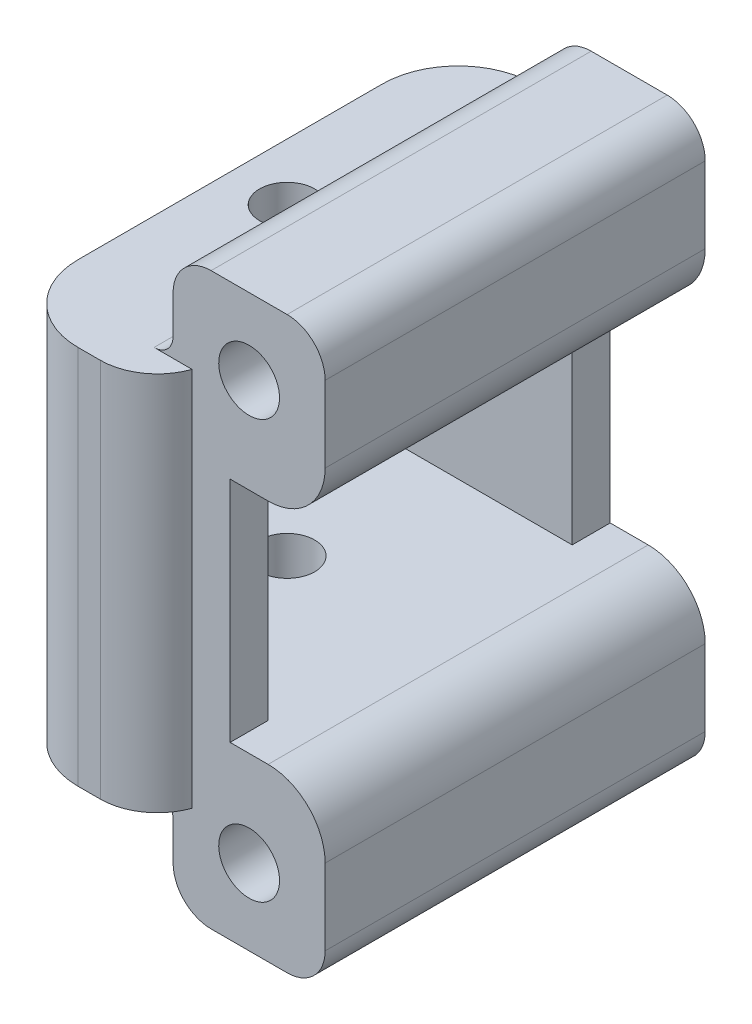
ISO-10303-21;
HEADER;
FILE_DESCRIPTION(('STEP AP214'),'2;1');
FILE_NAME('part.step','',(''),(''),'','','');
FILE_SCHEMA(('AUTOMOTIVE_DESIGN { 1 0 10303 214 1 1 1 1 }'));
ENDSEC;
DATA;
#1=APPLICATION_CONTEXT('core data for automotive mechanical design processes');
#2=APPLICATION_PROTOCOL_DEFINITION('international standard','automotive_design',2000,#1);
#3=PRODUCT_CONTEXT('',#1,'mechanical');
#4=PRODUCT('Part','Part','',(#3));
#5=PRODUCT_RELATED_PRODUCT_CATEGORY('part','',(#4));
#6=PRODUCT_DEFINITION_FORMATION('','',#4);
#7=PRODUCT_DEFINITION_CONTEXT('part definition',#1,'design');
#8=PRODUCT_DEFINITION('design','',#6,#7);
#9=PRODUCT_DEFINITION_SHAPE('','',#8);
#10=(LENGTH_UNIT() NAMED_UNIT(*) SI_UNIT(.MILLI.,.METRE.));
#11=(NAMED_UNIT(*) PLANE_ANGLE_UNIT() SI_UNIT($,.RADIAN.));
#12=(NAMED_UNIT(*) SI_UNIT($,.STERADIAN.) SOLID_ANGLE_UNIT());
#13=UNCERTAINTY_MEASURE_WITH_UNIT(LENGTH_MEASURE(1.E-05),#10,'distance_accuracy_value','');
#14=(GEOMETRIC_REPRESENTATION_CONTEXT(3) GLOBAL_UNCERTAINTY_ASSIGNED_CONTEXT((#13)) GLOBAL_UNIT_ASSIGNED_CONTEXT((#10,
#11,#12)) REPRESENTATION_CONTEXT('',''));
#15=CARTESIAN_POINT('',(0.,0.,0.));
#16=DIRECTION('',(0.,0.,1.));
#17=DIRECTION('',(1.,0.,0.));
#18=AXIS2_PLACEMENT_3D('',#15,#16,#17);
#19=CARTESIAN_POINT('',(6.,0.,0.));
#20=DIRECTION('',(1.,0.,0.));
#21=DIRECTION('',(0.,0.,-1.));
#22=AXIS2_PLACEMENT_3D('',#19,#20,#21);
#23=PLANE('',#22);
#24=DIRECTION('',(0.,0.,1.));
#25=VECTOR('',#24,1.);
#26=CARTESIAN_POINT('',(6.,0.,0.));
#27=LINE('',#26,#25);
#28=CARTESIAN_POINT('',(6.,0.,2.));
#29=VERTEX_POINT('',#28);
#30=CARTESIAN_POINT('',(6.,0.,18.));
#31=VERTEX_POINT('',#30);
#32=EDGE_CURVE('E235',#29,#31,#27,.T.);
#33=ORIENTED_EDGE('',*,*,#32,.F.);
#34=DIRECTION('',(0.,1.,0.));
#35=VECTOR('',#34,1.);
#36=CARTESIAN_POINT('',(6.,-20.,2.));
#37=LINE('',#36,#35);
#38=CARTESIAN_POINT('',(6.,-4.00000000000002,2.));
#39=VERTEX_POINT('',#38);
#40=EDGE_CURVE('E230',#29,#39,#37,.F.);
#41=ORIENTED_EDGE('',*,*,#40,.T.);
#42=DIRECTION('',(0.,0.,-1.));
#43=VECTOR('',#42,1.);
#44=CARTESIAN_POINT('',(6.,-4.,0.));
#45=LINE('',#44,#43);
#46=CARTESIAN_POINT('',(6.,-4.00000000000001,18.));
#47=VERTEX_POINT('',#46);
#48=EDGE_CURVE('E232',#47,#39,#45,.T.);
#49=ORIENTED_EDGE('',*,*,#48,.F.);
#50=DIRECTION('',(0.,-1.,0.));
#51=VECTOR('',#50,1.);
#52=CARTESIAN_POINT('',(6.,0.,18.));
#53=LINE('',#52,#51);
#54=EDGE_CURVE('E453',#47,#31,#53,.F.);
#55=ORIENTED_EDGE('',*,*,#54,.T.);
#56=EDGE_LOOP('',(#33,#41,#49,#55));
#57=FACE_BOUND('',#56,.T.);
#58=ADVANCED_FACE('F34',(#57),#23,.F.);
#59=CARTESIAN_POINT('',(4.,0.,0.));
#60=DIRECTION('',(0.,0.,1.));
#61=DIRECTION('',(0.,-1.,0.));
#62=AXIS2_PLACEMENT_3D('',#59,#60,#61);
#63=PLANE('',#62);
#64=CARTESIAN_POINT('',(17.,1.,0.));
#65=DIRECTION('',(0.,0.,-1.));
#66=DIRECTION('',(0.,1.,0.));
#67=AXIS2_PLACEMENT_3D('',#64,#65,#66);
#68=CIRCLE('',#67,1.6);
#69=CARTESIAN_POINT('',(17.,2.6,0.));
#70=VERTEX_POINT('',#69);
#71=EDGE_CURVE('E325',#70,#70,#68,.T.);
#72=ORIENTED_EDGE('',*,*,#71,.F.);
#73=EDGE_LOOP('',(#72));
#74=FACE_BOUND('',#73,.T.);
#75=CARTESIAN_POINT('',(16.9999999999991,-21.,0.));
#76=DIRECTION('',(0.,0.,-1.));
#77=DIRECTION('',(0.,1.,0.));
#78=AXIS2_PLACEMENT_3D('',#75,#76,#77);
#79=CIRCLE('',#78,1.6);
#80=CARTESIAN_POINT('',(16.9999999999991,-19.4,0.));
#81=VERTEX_POINT('',#80);
#82=EDGE_CURVE('E321',#81,#81,#79,.T.);
#83=ORIENTED_EDGE('',*,*,#82,.F.);
#84=EDGE_LOOP('',(#83));
#85=FACE_BOUND('',#84,.T.);
#86=DIRECTION('',(1.,0.,0.));
#87=VECTOR('',#86,1.);
#88=CARTESIAN_POINT('',(21.,-25.,0.));
#89=LINE('',#88,#87);
#90=CARTESIAN_POINT('',(15.,-25.,0.));
#91=VERTEX_POINT('',#90);
#92=CARTESIAN_POINT('',(19.,-25.,0.));
#93=VERTEX_POINT('',#92);
#94=EDGE_CURVE('E348',#91,#93,#89,.T.);
#95=ORIENTED_EDGE('',*,*,#94,.F.);
#96=CARTESIAN_POINT('',(15.,-23.,0.));
#97=DIRECTION('',(0.,0.,1.));
#98=DIRECTION('',(0.,-1.,0.));
#99=AXIS2_PLACEMENT_3D('',#96,#97,#98);
#100=CIRCLE('',#99,2.);
#101=CARTESIAN_POINT('',(13.,-23.,0.));
#102=VERTEX_POINT('',#101);
#103=EDGE_CURVE('E421',#91,#102,#100,.F.);
#104=ORIENTED_EDGE('',*,*,#103,.T.);
#105=DIRECTION('',(0.,1.,0.));
#106=VECTOR('',#105,1.);
#107=CARTESIAN_POINT('',(13.,-25.,0.));
#108=LINE('',#107,#106);
#109=CARTESIAN_POINT('',(13.,-21.,0.));
#110=VERTEX_POINT('',#109);
#111=EDGE_CURVE('E351',#102,#110,#108,.T.);
#112=ORIENTED_EDGE('',*,*,#111,.T.);
#113=CARTESIAN_POINT('',(12.,-21.,0.));
#114=DIRECTION('',(0.,0.,1.));
#115=DIRECTION('',(0.,-1.,0.));
#116=AXIS2_PLACEMENT_3D('',#113,#114,#115);
#117=CIRCLE('',#116,1.);
#118=CARTESIAN_POINT('',(12.,-20.,0.));
#119=VERTEX_POINT('',#118);
#120=EDGE_CURVE('E485',#110,#119,#117,.T.);
#121=ORIENTED_EDGE('',*,*,#120,.T.);
#122=DIRECTION('',(-1.,0.,0.));
#123=VECTOR('',#122,1.);
#124=CARTESIAN_POINT('',(6.,-20.,0.));
#125=LINE('',#124,#123);
#126=CARTESIAN_POINT('',(14.,-20.,0.));
#127=VERTEX_POINT('',#126);
#128=EDGE_CURVE('E285',#127,#119,#125,.T.);
#129=ORIENTED_EDGE('',*,*,#128,.F.);
#130=DIRECTION('',(0.,-1.,0.));
#131=VECTOR('',#130,1.);
#132=CARTESIAN_POINT('',(14.,-20.,0.));
#133=LINE('',#132,#131);
#134=CARTESIAN_POINT('',(14.,0.,0.));
#135=VERTEX_POINT('',#134);
#136=EDGE_CURVE('E280',#135,#127,#133,.T.);
#137=ORIENTED_EDGE('',*,*,#136,.F.);
#138=DIRECTION('',(1.,0.,0.));
#139=VECTOR('',#138,1.);
#140=CARTESIAN_POINT('',(6.,0.,0.));
#141=LINE('',#140,#139);
#142=CARTESIAN_POINT('',(12.,0.,0.));
#143=VERTEX_POINT('',#142);
#144=EDGE_CURVE('E56',#143,#135,#141,.T.);
#145=ORIENTED_EDGE('',*,*,#144,.F.);
#146=CARTESIAN_POINT('',(12.,1.,0.));
#147=DIRECTION('',(0.,0.,1.));
#148=DIRECTION('',(0.,-1.,0.));
#149=AXIS2_PLACEMENT_3D('',#146,#147,#148);
#150=CIRCLE('',#149,1.);
#151=CARTESIAN_POINT('',(13.,1.,0.));
#152=VERTEX_POINT('',#151);
#153=EDGE_CURVE('E11',#143,#152,#150,.T.);
#154=ORIENTED_EDGE('',*,*,#153,.T.);
#155=DIRECTION('',(0.,-1.,0.));
#156=VECTOR('',#155,1.);
#157=CARTESIAN_POINT('',(13.,5.,0.));
#158=LINE('',#157,#156);
#159=CARTESIAN_POINT('',(13.,3.,0.));
#160=VERTEX_POINT('',#159);
#161=EDGE_CURVE('E342',#160,#152,#158,.T.);
#162=ORIENTED_EDGE('',*,*,#161,.F.);
#163=CARTESIAN_POINT('',(15.,3.,0.));
#164=DIRECTION('',(0.,0.,1.));
#165=DIRECTION('',(0.,-1.,0.));
#166=AXIS2_PLACEMENT_3D('',#163,#164,#165);
#167=CIRCLE('',#166,2.);
#168=CARTESIAN_POINT('',(15.,5.,0.));
#169=VERTEX_POINT('',#168);
#170=EDGE_CURVE('E417',#160,#169,#167,.F.);
#171=ORIENTED_EDGE('',*,*,#170,.T.);
#172=DIRECTION('',(-1.,0.,0.));
#173=VECTOR('',#172,1.);
#174=CARTESIAN_POINT('',(21.,5.,0.));
#175=LINE('',#174,#173);
#176=CARTESIAN_POINT('',(19.,5.,0.));
#177=VERTEX_POINT('',#176);
#178=EDGE_CURVE('E331',#177,#169,#175,.T.);
#179=ORIENTED_EDGE('',*,*,#178,.F.);
#180=CARTESIAN_POINT('',(19.,3.,0.));
#181=DIRECTION('',(0.,0.,1.));
#182=DIRECTION('',(0.,-1.,0.));
#183=AXIS2_PLACEMENT_3D('',#180,#181,#182);
#184=CIRCLE('',#183,2.);
#185=CARTESIAN_POINT('',(21.,3.,0.));
#186=VERTEX_POINT('',#185);
#187=EDGE_CURVE('E415',#177,#186,#184,.F.);
#188=ORIENTED_EDGE('',*,*,#187,.T.);
#189=DIRECTION('',(0.,1.,0.));
#190=VECTOR('',#189,1.);
#191=CARTESIAN_POINT('',(21.,0.,0.));
#192=LINE('',#191,#190);
#193=CARTESIAN_POINT('',(21.,-1.,0.));
#194=VERTEX_POINT('',#193);
#195=EDGE_CURVE('E358',#194,#186,#192,.T.);
#196=ORIENTED_EDGE('',*,*,#195,.F.);
#197=CARTESIAN_POINT('',(18.,-1.,0.));
#198=DIRECTION('',(0.,0.,1.));
#199=DIRECTION('',(0.,-1.,0.));
#200=AXIS2_PLACEMENT_3D('',#197,#198,#199);
#201=CIRCLE('',#200,3.);
#202=CARTESIAN_POINT('',(18.,-4.,0.));
#203=VERTEX_POINT('',#202);
#204=EDGE_CURVE('E399',#194,#203,#201,.F.);
#205=ORIENTED_EDGE('',*,*,#204,.T.);
#206=DIRECTION('',(-1.,0.,0.));
#207=VECTOR('',#206,1.);
#208=CARTESIAN_POINT('',(21.,-4.,0.));
#209=LINE('',#208,#207);
#210=CARTESIAN_POINT('',(16.,-4.,0.));
#211=VERTEX_POINT('',#210);
#212=EDGE_CURVE('E363',#203,#211,#209,.T.);
#213=ORIENTED_EDGE('',*,*,#212,.T.);
#214=DIRECTION('',(0.,1.,0.));
#215=VECTOR('',#214,1.);
#216=CARTESIAN_POINT('',(16.,0.,0.));
#217=LINE('',#216,#215);
#218=CARTESIAN_POINT('',(16.,-16.,0.));
#219=VERTEX_POINT('',#218);
#220=EDGE_CURVE('E381',#219,#211,#217,.T.);
#221=ORIENTED_EDGE('',*,*,#220,.F.);
#222=DIRECTION('',(-1.,0.,0.));
#223=VECTOR('',#222,1.);
#224=CARTESIAN_POINT('',(21.,-16.,0.));
#225=LINE('',#224,#223);
#226=CARTESIAN_POINT('',(18.,-16.,0.));
#227=VERTEX_POINT('',#226);
#228=EDGE_CURVE('E379',#227,#219,#225,.T.);
#229=ORIENTED_EDGE('',*,*,#228,.F.);
#230=CARTESIAN_POINT('',(18.,-19.,0.));
#231=DIRECTION('',(0.,0.,1.));
#232=DIRECTION('',(0.,-1.,0.));
#233=AXIS2_PLACEMENT_3D('',#230,#231,#232);
#234=CIRCLE('',#233,3.);
#235=CARTESIAN_POINT('',(21.,-19.,0.));
#236=VERTEX_POINT('',#235);
#237=EDGE_CURVE('E401',#227,#236,#234,.F.);
#238=ORIENTED_EDGE('',*,*,#237,.T.);
#239=DIRECTION('',(0.,1.,0.));
#240=VECTOR('',#239,1.);
#241=CARTESIAN_POINT('',(21.,-20.,0.));
#242=LINE('',#241,#240);
#243=CARTESIAN_POINT('',(21.,-23.,0.));
#244=VERTEX_POINT('',#243);
#245=EDGE_CURVE('E369',#244,#236,#242,.T.);
#246=ORIENTED_EDGE('',*,*,#245,.F.);
#247=CARTESIAN_POINT('',(19.,-23.,0.));
#248=DIRECTION('',(0.,0.,1.));
#249=DIRECTION('',(0.,-1.,0.));
#250=AXIS2_PLACEMENT_3D('',#247,#248,#249);
#251=CIRCLE('',#250,2.);
#252=EDGE_CURVE('E419',#244,#93,#251,.F.);
#253=ORIENTED_EDGE('',*,*,#252,.T.);
#254=EDGE_LOOP('',(#95,#104,#112,#121,#129,#137,#145,#154,#162,#171,#179,#188,#196,#205,#213,
#221,#229,#238,#246,#253));
#255=FACE_BOUND('',#254,.T.);
#256=ADVANCED_FACE('F540',(#74,#85,#255),#63,.F.);
#257=CARTESIAN_POINT('',(4.,0.,20.));
#258=DIRECTION('',(0.,0.,-1.));
#259=DIRECTION('',(-1.,0.,0.));
#260=AXIS2_PLACEMENT_3D('',#257,#258,#259);
#261=PLANE('',#260);
#262=CARTESIAN_POINT('',(17.,1.,20.));
#263=DIRECTION('',(0.,0.,-1.));
#264=DIRECTION('',(0.,1.,0.));
#265=AXIS2_PLACEMENT_3D('',#262,#263,#264);
#266=CIRCLE('',#265,1.6);
#267=CARTESIAN_POINT('',(17.,2.6,20.));
#268=VERTEX_POINT('',#267);
#269=EDGE_CURVE('E328',#268,#268,#266,.T.);
#270=ORIENTED_EDGE('',*,*,#269,.T.);
#271=EDGE_LOOP('',(#270));
#272=FACE_BOUND('',#271,.T.);
#273=CARTESIAN_POINT('',(16.9999999999991,-21.,20.));
#274=DIRECTION('',(0.,0.,-1.));
#275=DIRECTION('',(0.,1.,0.));
#276=AXIS2_PLACEMENT_3D('',#273,#274,#275);
#277=CIRCLE('',#276,1.6);
#278=CARTESIAN_POINT('',(16.9999999999991,-19.4,20.));
#279=VERTEX_POINT('',#278);
#280=EDGE_CURVE('E322',#279,#279,#277,.T.);
#281=ORIENTED_EDGE('',*,*,#280,.T.);
#282=EDGE_LOOP('',(#281));
#283=FACE_BOUND('',#282,.T.);
#284=DIRECTION('',(0.,1.,0.));
#285=VECTOR('',#284,1.);
#286=CARTESIAN_POINT('',(13.,-25.,20.));
#287=LINE('',#286,#285);
#288=CARTESIAN_POINT('',(13.,-23.,20.));
#289=VERTEX_POINT('',#288);
#290=CARTESIAN_POINT('',(13.,-21.,20.));
#291=VERTEX_POINT('',#290);
#292=EDGE_CURVE('E354',#289,#291,#287,.T.);
#293=ORIENTED_EDGE('',*,*,#292,.F.);
#294=CARTESIAN_POINT('',(15.,-23.,20.));
#295=DIRECTION('',(0.,0.,-1.));
#296=DIRECTION('',(-1.,0.,0.));
#297=AXIS2_PLACEMENT_3D('',#294,#295,#296);
#298=CIRCLE('',#297,2.);
#299=CARTESIAN_POINT('',(15.,-25.,20.));
#300=VERTEX_POINT('',#299);
#301=EDGE_CURVE('E431',#289,#300,#298,.F.);
#302=ORIENTED_EDGE('',*,*,#301,.T.);
#303=DIRECTION('',(-1.,0.,0.));
#304=VECTOR('',#303,1.);
#305=CARTESIAN_POINT('',(21.,-25.,20.));
#306=LINE('',#305,#304);
#307=CARTESIAN_POINT('',(19.,-25.,20.));
#308=VERTEX_POINT('',#307);
#309=EDGE_CURVE('E345',#308,#300,#306,.T.);
#310=ORIENTED_EDGE('',*,*,#309,.F.);
#311=CARTESIAN_POINT('',(19.,-23.,20.));
#312=DIRECTION('',(0.,0.,-1.));
#313=DIRECTION('',(-1.,0.,0.));
#314=AXIS2_PLACEMENT_3D('',#311,#312,#313);
#315=CIRCLE('',#314,2.);
#316=CARTESIAN_POINT('',(21.,-23.,20.));
#317=VERTEX_POINT('',#316);
#318=EDGE_CURVE('E429',#308,#317,#315,.F.);
#319=ORIENTED_EDGE('',*,*,#318,.T.);
#320=DIRECTION('',(0.,-1.,0.));
#321=VECTOR('',#320,1.);
#322=CARTESIAN_POINT('',(21.,-20.,20.));
#323=LINE('',#322,#321);
#324=CARTESIAN_POINT('',(21.,-19.,20.));
#325=VERTEX_POINT('',#324);
#326=EDGE_CURVE('E371',#325,#317,#323,.T.);
#327=ORIENTED_EDGE('',*,*,#326,.F.);
#328=CARTESIAN_POINT('',(18.,-19.,20.));
#329=DIRECTION('',(0.,0.,-1.));
#330=DIRECTION('',(-1.,0.,0.));
#331=AXIS2_PLACEMENT_3D('',#328,#329,#330);
#332=CIRCLE('',#331,3.);
#333=CARTESIAN_POINT('',(18.,-16.,20.));
#334=VERTEX_POINT('',#333);
#335=EDGE_CURVE('E395',#325,#334,#332,.F.);
#336=ORIENTED_EDGE('',*,*,#335,.T.);
#337=DIRECTION('',(-1.,0.,0.));
#338=VECTOR('',#337,1.);
#339=CARTESIAN_POINT('',(21.,-16.,20.));
#340=LINE('',#339,#338);
#341=CARTESIAN_POINT('',(16.,-16.,20.));
#342=VERTEX_POINT('',#341);
#343=EDGE_CURVE('E374',#334,#342,#340,.T.);
#344=ORIENTED_EDGE('',*,*,#343,.T.);
#345=DIRECTION('',(0.,-1.,0.));
#346=VECTOR('',#345,1.);
#347=CARTESIAN_POINT('',(16.,0.,20.));
#348=LINE('',#347,#346);
#349=CARTESIAN_POINT('',(16.,-4.,20.));
#350=VERTEX_POINT('',#349);
#351=EDGE_CURVE('E384',#350,#342,#348,.T.);
#352=ORIENTED_EDGE('',*,*,#351,.F.);
#353=DIRECTION('',(-1.,0.,0.));
#354=VECTOR('',#353,1.);
#355=CARTESIAN_POINT('',(21.,-4.,20.));
#356=LINE('',#355,#354);
#357=CARTESIAN_POINT('',(18.,-4.,20.));
#358=VERTEX_POINT('',#357);
#359=EDGE_CURVE('E366',#358,#350,#356,.T.);
#360=ORIENTED_EDGE('',*,*,#359,.F.);
#361=CARTESIAN_POINT('',(18.,-1.,20.));
#362=DIRECTION('',(0.,0.,-1.));
#363=DIRECTION('',(-1.,0.,0.));
#364=AXIS2_PLACEMENT_3D('',#361,#362,#363);
#365=CIRCLE('',#364,3.);
#366=CARTESIAN_POINT('',(21.,-1.,20.));
#367=VERTEX_POINT('',#366);
#368=EDGE_CURVE('E392',#358,#367,#365,.F.);
#369=ORIENTED_EDGE('',*,*,#368,.T.);
#370=DIRECTION('',(0.,-1.,0.));
#371=VECTOR('',#370,1.);
#372=CARTESIAN_POINT('',(21.,0.,20.));
#373=LINE('',#372,#371);
#374=CARTESIAN_POINT('',(21.,3.,20.));
#375=VERTEX_POINT('',#374);
#376=EDGE_CURVE('E361',#375,#367,#373,.T.);
#377=ORIENTED_EDGE('',*,*,#376,.F.);
#378=CARTESIAN_POINT('',(19.,3.,20.));
#379=DIRECTION('',(0.,0.,-1.));
#380=DIRECTION('',(-1.,0.,0.));
#381=AXIS2_PLACEMENT_3D('',#378,#379,#380);
#382=CIRCLE('',#381,2.);
#383=CARTESIAN_POINT('',(19.,5.,20.));
#384=VERTEX_POINT('',#383);
#385=EDGE_CURVE('E425',#375,#384,#382,.F.);
#386=ORIENTED_EDGE('',*,*,#385,.T.);
#387=DIRECTION('',(1.,0.,0.));
#388=VECTOR('',#387,1.);
#389=CARTESIAN_POINT('',(21.,5.,20.));
#390=LINE('',#389,#388);
#391=CARTESIAN_POINT('',(15.,5.,20.));
#392=VERTEX_POINT('',#391);
#393=EDGE_CURVE('E336',#392,#384,#390,.T.);
#394=ORIENTED_EDGE('',*,*,#393,.F.);
#395=CARTESIAN_POINT('',(15.,3.,20.));
#396=DIRECTION('',(0.,0.,-1.));
#397=DIRECTION('',(-1.,0.,0.));
#398=AXIS2_PLACEMENT_3D('',#395,#396,#397);
#399=CIRCLE('',#398,2.);
#400=CARTESIAN_POINT('',(13.,3.,20.));
#401=VERTEX_POINT('',#400);
#402=EDGE_CURVE('E427',#392,#401,#399,.F.);
#403=ORIENTED_EDGE('',*,*,#402,.T.);
#404=DIRECTION('',(0.,-1.,0.));
#405=VECTOR('',#404,1.);
#406=CARTESIAN_POINT('',(13.,5.,20.));
#407=LINE('',#406,#405);
#408=CARTESIAN_POINT('',(13.,0.999999999999997,20.));
#409=VERTEX_POINT('',#408);
#410=EDGE_CURVE('E339',#401,#409,#407,.T.);
#411=ORIENTED_EDGE('',*,*,#410,.T.);
#412=CARTESIAN_POINT('',(12.,0.999999999999996,20.));
#413=DIRECTION('',(0.,0.,-1.));
#414=DIRECTION('',(-1.,0.,0.));
#415=AXIS2_PLACEMENT_3D('',#412,#413,#414);
#416=CIRCLE('',#415,1.);
#417=CARTESIAN_POINT('',(12.,0.,20.));
#418=VERTEX_POINT('',#417);
#419=EDGE_CURVE('E42',#409,#418,#416,.T.);
#420=ORIENTED_EDGE('',*,*,#419,.T.);
#421=DIRECTION('',(-1.,0.,0.));
#422=VECTOR('',#421,1.);
#423=CARTESIAN_POINT('',(6.,0.,20.));
#424=LINE('',#423,#422);
#425=CARTESIAN_POINT('',(14.,0.,20.));
#426=VERTEX_POINT('',#425);
#427=EDGE_CURVE('E49',#426,#418,#424,.T.);
#428=ORIENTED_EDGE('',*,*,#427,.F.);
#429=DIRECTION('',(0.,1.,0.));
#430=VECTOR('',#429,1.);
#431=CARTESIAN_POINT('',(14.,-20.,20.));
#432=LINE('',#431,#430);
#433=CARTESIAN_POINT('',(14.,-20.,20.));
#434=VERTEX_POINT('',#433);
#435=EDGE_CURVE('E287',#434,#426,#432,.T.);
#436=ORIENTED_EDGE('',*,*,#435,.F.);
#437=DIRECTION('',(1.,0.,0.));
#438=VECTOR('',#437,1.);
#439=CARTESIAN_POINT('',(6.,-20.,20.));
#440=LINE('',#439,#438);
#441=CARTESIAN_POINT('',(12.,-20.,20.));
#442=VERTEX_POINT('',#441);
#443=EDGE_CURVE('E290',#442,#434,#440,.T.);
#444=ORIENTED_EDGE('',*,*,#443,.F.);
#445=CARTESIAN_POINT('',(12.,-21.,20.));
#446=DIRECTION('',(0.,0.,-1.));
#447=DIRECTION('',(-1.,0.,0.));
#448=AXIS2_PLACEMENT_3D('',#445,#446,#447);
#449=CIRCLE('',#448,1.);
#450=EDGE_CURVE('E488',#442,#291,#449,.T.);
#451=ORIENTED_EDGE('',*,*,#450,.T.);
#452=EDGE_LOOP('',(#293,#302,#310,#319,#327,#336,#344,#352,#360,#369,#377,#386,#394,#403,#411,
#420,#428,#436,#444,#451));
#453=FACE_BOUND('',#452,.T.);
#454=ADVANCED_FACE('F497',(#272,#283,#453),#261,.F.);
#455=CARTESIAN_POINT('',(4.,0.,0.));
#456=DIRECTION('',(0.,-1.,0.));
#457=DIRECTION('',(0.,0.,-1.));
#458=AXIS2_PLACEMENT_3D('',#455,#456,#457);
#459=PLANE('',#458);
#460=CARTESIAN_POINT('',(9.00000000000001,0.,10.));
#461=DIRECTION('',(0.,1.,0.));
#462=DIRECTION('',(0.,0.,1.));
#463=AXIS2_PLACEMENT_3D('',#460,#461,#462);
#464=CIRCLE('',#463,1.45);
#465=CARTESIAN_POINT('',(9.00000000000001,0.,11.45));
#466=VERTEX_POINT('',#465);
#467=EDGE_CURVE('E299',#466,#466,#464,.T.);
#468=ORIENTED_EDGE('',*,*,#467,.F.);
#469=EDGE_LOOP('',(#468));
#470=FACE_BOUND('',#469,.T.);
#471=ORIENTED_EDGE('',*,*,#427,.T.);
#472=DIRECTION('',(0.,0.,1.));
#473=VECTOR('',#472,1.);
#474=CARTESIAN_POINT('',(12.,0.,0.));
#475=LINE('',#474,#473);
#476=EDGE_CURVE('E493',#418,#143,#475,.F.);
#477=ORIENTED_EDGE('',*,*,#476,.T.);
#478=ORIENTED_EDGE('',*,*,#144,.T.);
#479=CARTESIAN_POINT('',(11.1715728752538,0.,1.));
#480=DIRECTION('',(0.,-1.,0.));
#481=DIRECTION('',(0.,0.,-1.));
#482=AXIS2_PLACEMENT_3D('',#479,#480,#481);
#483=CIRCLE('',#482,3.);
#484=CARTESIAN_POINT('',(11.1715728752538,0.,-2.));
#485=VERTEX_POINT('',#484);
#486=EDGE_CURVE('E474',#135,#485,#483,.F.);
#487=ORIENTED_EDGE('',*,*,#486,.T.);
#488=DIRECTION('',(1.,0.,0.));
#489=VECTOR('',#488,1.);
#490=CARTESIAN_POINT('',(6.,0.,-2.));
#491=LINE('',#490,#489);
#492=CARTESIAN_POINT('',(10.,0.,-2.));
#493=VERTEX_POINT('',#492);
#494=EDGE_CURVE('E281',#493,#485,#491,.T.);
#495=ORIENTED_EDGE('',*,*,#494,.F.);
#496=CARTESIAN_POINT('',(10.,0.,2.));
#497=DIRECTION('',(0.,-1.,0.));
#498=DIRECTION('',(0.,0.,-1.));
#499=AXIS2_PLACEMENT_3D('',#496,#497,#498);
#500=CIRCLE('',#499,4.);
#501=EDGE_CURVE('E451',#493,#29,#500,.F.);
#502=ORIENTED_EDGE('',*,*,#501,.T.);
#503=ORIENTED_EDGE('',*,*,#32,.T.);
#504=CARTESIAN_POINT('',(10.,0.,18.));
#505=DIRECTION('',(0.,-1.,0.));
#506=DIRECTION('',(0.,0.,-1.));
#507=AXIS2_PLACEMENT_3D('',#504,#505,#506);
#508=CIRCLE('',#507,4.);
#509=CARTESIAN_POINT('',(10.,0.,22.));
#510=VERTEX_POINT('',#509);
#511=EDGE_CURVE('E448',#31,#510,#508,.F.);
#512=ORIENTED_EDGE('',*,*,#511,.T.);
#513=DIRECTION('',(-1.,0.,0.));
#514=VECTOR('',#513,1.);
#515=CARTESIAN_POINT('',(6.,0.,22.));
#516=LINE('',#515,#514);
#517=CARTESIAN_POINT('',(11.1715728752538,0.,22.));
#518=VERTEX_POINT('',#517);
#519=EDGE_CURVE('E297',#518,#510,#516,.T.);
#520=ORIENTED_EDGE('',*,*,#519,.F.);
#521=CARTESIAN_POINT('',(11.1715728752538,0.,19.));
#522=DIRECTION('',(0.,-1.,0.));
#523=DIRECTION('',(0.,0.,-1.));
#524=AXIS2_PLACEMENT_3D('',#521,#522,#523);
#525=CIRCLE('',#524,3.);
#526=EDGE_CURVE('E472',#518,#426,#525,.F.);
#527=ORIENTED_EDGE('',*,*,#526,.T.);
#528=EDGE_LOOP('',(#471,#477,#478,#487,#495,#502,#503,#512,#520,#527));
#529=FACE_BOUND('',#528,.T.);
#530=ADVANCED_FACE('F502',(#470,#529),#459,.F.);
#531=CARTESIAN_POINT('',(4.,-20.,0.));
#532=DIRECTION('',(0.,1.,0.));
#533=DIRECTION('',(0.,0.,1.));
#534=AXIS2_PLACEMENT_3D('',#531,#532,#533);
#535=PLANE('',#534);
#536=CARTESIAN_POINT('',(9.00000000000001,-20.,10.));
#537=DIRECTION('',(0.,1.,0.));
#538=DIRECTION('',(0.,0.,1.));
#539=AXIS2_PLACEMENT_3D('',#536,#537,#538);
#540=CIRCLE('',#539,1.45);
#541=CARTESIAN_POINT('',(9.00000000000001,-20.,11.45));
#542=VERTEX_POINT('',#541);
#543=EDGE_CURVE('E312',#542,#542,#540,.T.);
#544=ORIENTED_EDGE('',*,*,#543,.T.);
#545=EDGE_LOOP('',(#544));
#546=FACE_BOUND('',#545,.T.);
#547=ORIENTED_EDGE('',*,*,#128,.T.);
#548=DIRECTION('',(0.,0.,-1.));
#549=VECTOR('',#548,1.);
#550=CARTESIAN_POINT('',(12.,-20.,20.));
#551=LINE('',#550,#549);
#552=EDGE_CURVE('E482',#119,#442,#551,.F.);
#553=ORIENTED_EDGE('',*,*,#552,.T.);
#554=ORIENTED_EDGE('',*,*,#443,.T.);
#555=CARTESIAN_POINT('',(11.1715728752538,-20.,19.));
#556=DIRECTION('',(0.,1.,0.));
#557=DIRECTION('',(0.,0.,1.));
#558=AXIS2_PLACEMENT_3D('',#555,#556,#557);
#559=CIRCLE('',#558,3.);
#560=CARTESIAN_POINT('',(11.1715728752538,-20.,22.));
#561=VERTEX_POINT('',#560);
#562=EDGE_CURVE('E468',#434,#561,#559,.F.);
#563=ORIENTED_EDGE('',*,*,#562,.T.);
#564=DIRECTION('',(1.,0.,0.));
#565=VECTOR('',#564,1.);
#566=CARTESIAN_POINT('',(6.,-20.,22.));
#567=LINE('',#566,#565);
#568=CARTESIAN_POINT('',(10.,-20.,22.));
#569=VERTEX_POINT('',#568);
#570=EDGE_CURVE('E294',#569,#561,#567,.T.);
#571=ORIENTED_EDGE('',*,*,#570,.F.);
#572=CARTESIAN_POINT('',(10.,-20.,18.));
#573=DIRECTION('',(0.,1.,0.));
#574=DIRECTION('',(0.,0.,1.));
#575=AXIS2_PLACEMENT_3D('',#572,#573,#574);
#576=CIRCLE('',#575,4.);
#577=CARTESIAN_POINT('',(6.,-20.,18.));
#578=VERTEX_POINT('',#577);
#579=EDGE_CURVE('E238',#569,#578,#576,.F.);
#580=ORIENTED_EDGE('',*,*,#579,.T.);
#581=DIRECTION('',(0.,0.,1.));
#582=VECTOR('',#581,1.);
#583=CARTESIAN_POINT('',(6.,-20.,0.));
#584=LINE('',#583,#582);
#585=CARTESIAN_POINT('',(6.,-20.,2.));
#586=VERTEX_POINT('',#585);
#587=EDGE_CURVE('E315',#586,#578,#584,.T.);
#588=ORIENTED_EDGE('',*,*,#587,.F.);
#589=CARTESIAN_POINT('',(10.,-20.,2.));
#590=DIRECTION('',(0.,1.,0.));
#591=DIRECTION('',(0.,0.,1.));
#592=AXIS2_PLACEMENT_3D('',#589,#590,#591);
#593=CIRCLE('',#592,4.);
#594=CARTESIAN_POINT('',(10.,-20.,-2.));
#595=VERTEX_POINT('',#594);
#596=EDGE_CURVE('E459',#586,#595,#593,.F.);
#597=ORIENTED_EDGE('',*,*,#596,.T.);
#598=DIRECTION('',(-1.,0.,0.));
#599=VECTOR('',#598,1.);
#600=CARTESIAN_POINT('',(6.,-20.,-2.));
#601=LINE('',#600,#599);
#602=CARTESIAN_POINT('',(11.1715728752538,-20.,-2.));
#603=VERTEX_POINT('',#602);
#604=EDGE_CURVE('E284',#603,#595,#601,.T.);
#605=ORIENTED_EDGE('',*,*,#604,.F.);
#606=CARTESIAN_POINT('',(11.1715728752538,-20.,1.));
#607=DIRECTION('',(0.,1.,0.));
#608=DIRECTION('',(0.,0.,1.));
#609=AXIS2_PLACEMENT_3D('',#606,#607,#608);
#610=CIRCLE('',#609,3.);
#611=EDGE_CURVE('E470',#603,#127,#610,.F.);
#612=ORIENTED_EDGE('',*,*,#611,.T.);
#613=EDGE_LOOP('',(#547,#553,#554,#563,#571,#580,#588,#597,#605,#612));
#614=FACE_BOUND('',#613,.T.);
#615=ADVANCED_FACE('F512',(#546,#614),#535,.F.);
#616=CARTESIAN_POINT('',(16.,0.,0.));
#617=DIRECTION('',(1.,0.,0.));
#618=DIRECTION('',(0.,0.,-1.));
#619=AXIS2_PLACEMENT_3D('',#616,#617,#618);
#620=PLANE('',#619);
#621=DIRECTION('',(0.,1.,0.));
#622=VECTOR('',#621,1.);
#623=CARTESIAN_POINT('',(16.,0.,2.));
#624=LINE('',#623,#622);
#625=CARTESIAN_POINT('',(16.,-16.,2.));
#626=VERTEX_POINT('',#625);
#627=CARTESIAN_POINT('',(16.,-4.00000000000002,2.));
#628=VERTEX_POINT('',#627);
#629=EDGE_CURVE('E262',#626,#628,#624,.T.);
#630=ORIENTED_EDGE('',*,*,#629,.F.);
#631=DIRECTION('',(0.,0.,1.));
#632=VECTOR('',#631,1.);
#633=CARTESIAN_POINT('',(16.,-16.,0.));
#634=LINE('',#633,#632);
#635=EDGE_CURVE('E368',#219,#626,#634,.T.);
#636=ORIENTED_EDGE('',*,*,#635,.F.);
#637=ORIENTED_EDGE('',*,*,#220,.T.);
#638=DIRECTION('',(0.,0.,1.));
#639=VECTOR('',#638,1.);
#640=CARTESIAN_POINT('',(16.,-4.,0.));
#641=LINE('',#640,#639);
#642=EDGE_CURVE('E302',#211,#628,#641,.T.);
#643=ORIENTED_EDGE('',*,*,#642,.T.);
#644=EDGE_LOOP('',(#630,#636,#637,#643));
#645=FACE_BOUND('',#644,.T.);
#646=ADVANCED_FACE('F635',(#645),#620,.T.);
#647=DIRECTION('',(0.,-1.,0.));
#648=VECTOR('',#647,1.);
#649=CARTESIAN_POINT('',(16.,0.,18.));
#650=LINE('',#649,#648);
#651=CARTESIAN_POINT('',(16.,-4.00000000000001,18.));
#652=VERTEX_POINT('',#651);
#653=CARTESIAN_POINT('',(16.,-16.,18.));
#654=VERTEX_POINT('',#653);
#655=EDGE_CURVE('E278',#652,#654,#650,.T.);
#656=ORIENTED_EDGE('',*,*,#655,.F.);
#657=DIRECTION('',(0.,0.,-1.));
#658=VECTOR('',#657,1.);
#659=CARTESIAN_POINT('',(16.,-4.,0.));
#660=LINE('',#659,#658);
#661=EDGE_CURVE('E357',#350,#652,#660,.T.);
#662=ORIENTED_EDGE('',*,*,#661,.F.);
#663=ORIENTED_EDGE('',*,*,#351,.T.);
#664=EDGE_CURVE('E377',#654,#342,#634,.T.);
#665=ORIENTED_EDGE('',*,*,#664,.F.);
#666=EDGE_LOOP('',(#656,#662,#663,#665));
#667=FACE_BOUND('',#666,.T.);
#668=ADVANCED_FACE('F575',(#667),#620,.T.);
#669=CARTESIAN_POINT('',(16.,-4.,0.));
#670=DIRECTION('',(0.,1.,0.));
#671=DIRECTION('',(0.,0.,1.));
#672=AXIS2_PLACEMENT_3D('',#669,#670,#671);
#673=PLANE('',#672);
#674=ORIENTED_EDGE('',*,*,#212,.F.);
#675=DIRECTION('',(0.,0.,-1.));
#676=VECTOR('',#675,1.);
#677=CARTESIAN_POINT('',(18.,-4.,0.));
#678=LINE('',#677,#676);
#679=EDGE_CURVE('E407',#203,#358,#678,.F.);
#680=ORIENTED_EDGE('',*,*,#679,.T.);
#681=ORIENTED_EDGE('',*,*,#359,.T.);
#682=ORIENTED_EDGE('',*,*,#661,.T.);
#683=DIRECTION('',(-1.,0.,0.));
#684=VECTOR('',#683,1.);
#685=CARTESIAN_POINT('',(21.,-4.00000000000001,18.));
#686=LINE('',#685,#684);
#687=EDGE_CURVE('E252',#652,#47,#686,.T.);
#688=ORIENTED_EDGE('',*,*,#687,.T.);
#689=ORIENTED_EDGE('',*,*,#48,.T.);
#690=DIRECTION('',(-1.,0.,0.));
#691=VECTOR('',#690,1.);
#692=CARTESIAN_POINT('',(21.,-4.00000000000002,2.));
#693=LINE('',#692,#691);
#694=EDGE_CURVE('E249',#628,#39,#693,.T.);
#695=ORIENTED_EDGE('',*,*,#694,.F.);
#696=ORIENTED_EDGE('',*,*,#642,.F.);
#697=EDGE_LOOP('',(#674,#680,#681,#682,#688,#689,#695,#696));
#698=FACE_BOUND('',#697,.T.);
#699=CARTESIAN_POINT('',(9.00000000000001,-4.,10.));
#700=DIRECTION('',(0.,1.,0.));
#701=DIRECTION('',(0.,0.,1.));
#702=AXIS2_PLACEMENT_3D('',#699,#700,#701);
#703=CIRCLE('',#702,1.45);
#704=CARTESIAN_POINT('',(9.00000000000001,-4.,11.45));
#705=VERTEX_POINT('',#704);
#706=EDGE_CURVE('E309',#705,#705,#703,.T.);
#707=ORIENTED_EDGE('',*,*,#706,.T.);
#708=EDGE_LOOP('',(#707));
#709=FACE_BOUND('',#708,.T.);
#710=ADVANCED_FACE('F246',(#698,#709),#673,.F.);
#711=CARTESIAN_POINT('',(16.,-16.,0.));
#712=DIRECTION('',(0.,-1.,0.));
#713=DIRECTION('',(0.,0.,-1.));
#714=AXIS2_PLACEMENT_3D('',#711,#712,#713);
#715=PLANE('',#714);
#716=ORIENTED_EDGE('',*,*,#343,.F.);
#717=DIRECTION('',(0.,0.,1.));
#718=VECTOR('',#717,1.);
#719=CARTESIAN_POINT('',(18.,-16.,0.));
#720=LINE('',#719,#718);
#721=EDGE_CURVE('E397',#334,#227,#720,.F.);
#722=ORIENTED_EDGE('',*,*,#721,.T.);
#723=ORIENTED_EDGE('',*,*,#228,.T.);
#724=ORIENTED_EDGE('',*,*,#635,.T.);
#725=DIRECTION('',(-1.,0.,0.));
#726=VECTOR('',#725,1.);
#727=CARTESIAN_POINT('',(21.,-16.,2.));
#728=LINE('',#727,#726);
#729=CARTESIAN_POINT('',(6.,-16.,2.));
#730=VERTEX_POINT('',#729);
#731=EDGE_CURVE('E263',#626,#730,#728,.T.);
#732=ORIENTED_EDGE('',*,*,#731,.T.);
#733=DIRECTION('',(0.,0.,1.));
#734=VECTOR('',#733,1.);
#735=CARTESIAN_POINT('',(6.,-16.,0.));
#736=LINE('',#735,#734);
#737=CARTESIAN_POINT('',(6.,-16.,18.));
#738=VERTEX_POINT('',#737);
#739=EDGE_CURVE('E254',#730,#738,#736,.T.);
#740=ORIENTED_EDGE('',*,*,#739,.T.);
#741=DIRECTION('',(-1.,0.,0.));
#742=VECTOR('',#741,1.);
#743=CARTESIAN_POINT('',(21.,-16.,18.));
#744=LINE('',#743,#742);
#745=EDGE_CURVE('E272',#654,#738,#744,.T.);
#746=ORIENTED_EDGE('',*,*,#745,.F.);
#747=ORIENTED_EDGE('',*,*,#664,.T.);
#748=EDGE_LOOP('',(#716,#722,#723,#724,#732,#740,#746,#747));
#749=FACE_BOUND('',#748,.T.);
#750=CARTESIAN_POINT('',(9.00000000000001,-16.,10.));
#751=DIRECTION('',(0.,-1.,0.));
#752=DIRECTION('',(0.,0.,-1.));
#753=AXIS2_PLACEMENT_3D('',#750,#751,#752);
#754=CIRCLE('',#753,1.45);
#755=CARTESIAN_POINT('',(9.00000000000001,-16.,8.55));
#756=VERTEX_POINT('',#755);
#757=EDGE_CURVE('E308',#756,#756,#754,.T.);
#758=ORIENTED_EDGE('',*,*,#757,.T.);
#759=EDGE_LOOP('',(#758));
#760=FACE_BOUND('',#759,.T.);
#761=ADVANCED_FACE('F568',(#749,#760),#715,.F.);
#762=CARTESIAN_POINT('',(21.,0.,0.));
#763=DIRECTION('',(1.,0.,0.));
#764=DIRECTION('',(0.,0.,-1.));
#765=AXIS2_PLACEMENT_3D('',#762,#763,#764);
#766=PLANE('',#765);
#767=ORIENTED_EDGE('',*,*,#326,.T.);
#768=DIRECTION('',(0.,0.,1.));
#769=VECTOR('',#768,1.);
#770=CARTESIAN_POINT('',(21.,-23.,0.));
#771=LINE('',#770,#769);
#772=EDGE_CURVE('E433',#317,#244,#771,.F.);
#773=ORIENTED_EDGE('',*,*,#772,.T.);
#774=ORIENTED_EDGE('',*,*,#245,.T.);
#775=DIRECTION('',(0.,0.,1.));
#776=VECTOR('',#775,1.);
#777=CARTESIAN_POINT('',(21.,-19.,20.));
#778=LINE('',#777,#776);
#779=EDGE_CURVE('E289',#236,#325,#778,.T.);
#780=ORIENTED_EDGE('',*,*,#779,.T.);
#781=EDGE_LOOP('',(#767,#773,#774,#780));
#782=FACE_BOUND('',#781,.T.);
#783=ADVANCED_FACE('F553',(#782),#766,.T.);
#784=CARTESIAN_POINT('',(21.,0.,0.));
#785=DIRECTION('',(-1.,0.,0.));
#786=DIRECTION('',(0.,0.,1.));
#787=AXIS2_PLACEMENT_3D('',#784,#785,#786);
#788=PLANE('',#787);
#789=ORIENTED_EDGE('',*,*,#195,.T.);
#790=DIRECTION('',(0.,0.,-1.));
#791=VECTOR('',#790,1.);
#792=CARTESIAN_POINT('',(21.,3.,0.));
#793=LINE('',#792,#791);
#794=EDGE_CURVE('E443',#186,#375,#793,.F.);
#795=ORIENTED_EDGE('',*,*,#794,.T.);
#796=ORIENTED_EDGE('',*,*,#376,.T.);
#797=DIRECTION('',(0.,0.,-1.));
#798=VECTOR('',#797,1.);
#799=CARTESIAN_POINT('',(21.,-1.,0.));
#800=LINE('',#799,#798);
#801=EDGE_CURVE('E404',#367,#194,#800,.T.);
#802=ORIENTED_EDGE('',*,*,#801,.T.);
#803=EDGE_LOOP('',(#789,#795,#796,#802));
#804=FACE_BOUND('',#803,.T.);
#805=ADVANCED_FACE('F585',(#804),#788,.F.);
#806=CARTESIAN_POINT('',(13.,-25.,0.));
#807=DIRECTION('',(1.,0.,0.));
#808=DIRECTION('',(0.,0.,-1.));
#809=AXIS2_PLACEMENT_3D('',#806,#807,#808);
#810=PLANE('',#809);
#811=ORIENTED_EDGE('',*,*,#292,.T.);
#812=DIRECTION('',(0.,0.,-1.));
#813=VECTOR('',#812,1.);
#814=CARTESIAN_POINT('',(13.,-21.,0.));
#815=LINE('',#814,#813);
#816=EDGE_CURVE('E479',#291,#110,#815,.T.);
#817=ORIENTED_EDGE('',*,*,#816,.T.);
#818=ORIENTED_EDGE('',*,*,#111,.F.);
#819=DIRECTION('',(0.,0.,-1.));
#820=VECTOR('',#819,1.);
#821=CARTESIAN_POINT('',(13.,-23.,20.));
#822=LINE('',#821,#820);
#823=EDGE_CURVE('E423',#102,#289,#822,.F.);
#824=ORIENTED_EDGE('',*,*,#823,.T.);
#825=EDGE_LOOP('',(#811,#817,#818,#824));
#826=FACE_BOUND('',#825,.T.);
#827=ADVANCED_FACE('F537',(#826),#810,.F.);
#828=CARTESIAN_POINT('',(0.,-25.,0.));
#829=DIRECTION('',(0.,-1.,0.));
#830=DIRECTION('',(0.,0.,-1.));
#831=AXIS2_PLACEMENT_3D('',#828,#829,#830);
#832=PLANE('',#831);
#833=ORIENTED_EDGE('',*,*,#309,.T.);
#834=DIRECTION('',(0.,0.,-1.));
#835=VECTOR('',#834,1.);
#836=CARTESIAN_POINT('',(15.,-25.,0.));
#837=LINE('',#836,#835);
#838=EDGE_CURVE('E412',#300,#91,#837,.T.);
#839=ORIENTED_EDGE('',*,*,#838,.T.);
#840=ORIENTED_EDGE('',*,*,#94,.T.);
#841=DIRECTION('',(0.,0.,1.));
#842=VECTOR('',#841,1.);
#843=CARTESIAN_POINT('',(19.,-25.,0.));
#844=LINE('',#843,#842);
#845=EDGE_CURVE('E409',#93,#308,#844,.T.);
#846=ORIENTED_EDGE('',*,*,#845,.T.);
#847=EDGE_LOOP('',(#833,#839,#840,#846));
#848=FACE_BOUND('',#847,.T.);
#849=ADVANCED_FACE('F546',(#848),#832,.T.);
#850=CARTESIAN_POINT('',(13.,5.,0.));
#851=DIRECTION('',(1.,0.,0.));
#852=DIRECTION('',(0.,0.,-1.));
#853=AXIS2_PLACEMENT_3D('',#850,#851,#852);
#854=PLANE('',#853);
#855=ORIENTED_EDGE('',*,*,#161,.T.);
#856=DIRECTION('',(0.,0.,1.));
#857=VECTOR('',#856,1.);
#858=CARTESIAN_POINT('',(13.,0.999999999999996,20.));
#859=LINE('',#858,#857);
#860=EDGE_CURVE('E490',#152,#409,#859,.T.);
#861=ORIENTED_EDGE('',*,*,#860,.T.);
#862=ORIENTED_EDGE('',*,*,#410,.F.);
#863=DIRECTION('',(0.,0.,1.));
#864=VECTOR('',#863,1.);
#865=CARTESIAN_POINT('',(13.,3.,0.));
#866=LINE('',#865,#864);
#867=EDGE_CURVE('E441',#401,#160,#866,.F.);
#868=ORIENTED_EDGE('',*,*,#867,.T.);
#869=EDGE_LOOP('',(#855,#861,#862,#868));
#870=FACE_BOUND('',#869,.T.);
#871=ADVANCED_FACE('F599',(#870),#854,.F.);
#872=CARTESIAN_POINT('',(0.,5.,0.));
#873=DIRECTION('',(0.,-1.,0.));
#874=DIRECTION('',(0.,0.,-1.));
#875=AXIS2_PLACEMENT_3D('',#872,#873,#874);
#876=PLANE('',#875);
#877=ORIENTED_EDGE('',*,*,#178,.T.);
#878=DIRECTION('',(0.,0.,1.));
#879=VECTOR('',#878,1.);
#880=CARTESIAN_POINT('',(15.,5.,0.));
#881=LINE('',#880,#879);
#882=EDGE_CURVE('E438',#169,#392,#881,.T.);
#883=ORIENTED_EDGE('',*,*,#882,.T.);
#884=ORIENTED_EDGE('',*,*,#393,.T.);
#885=DIRECTION('',(0.,0.,-1.));
#886=VECTOR('',#885,1.);
#887=CARTESIAN_POINT('',(19.,5.,0.));
#888=LINE('',#887,#886);
#889=EDGE_CURVE('E435',#384,#177,#888,.T.);
#890=ORIENTED_EDGE('',*,*,#889,.T.);
#891=EDGE_LOOP('',(#877,#883,#884,#890));
#892=FACE_BOUND('',#891,.T.);
#893=ADVANCED_FACE('F593',(#892),#876,.F.);
#894=CARTESIAN_POINT('',(17.,1.,20.));
#895=DIRECTION('',(0.,0.,-1.));
#896=DIRECTION('',(0.,1.,0.));
#897=AXIS2_PLACEMENT_3D('',#894,#895,#896);
#898=CYLINDRICAL_SURFACE('',#897,1.6);
#899=ORIENTED_EDGE('',*,*,#269,.F.);
#900=EDGE_LOOP('',(#899));
#901=FACE_BOUND('',#900,.T.);
#902=ORIENTED_EDGE('',*,*,#71,.T.);
#903=EDGE_LOOP('',(#902));
#904=FACE_BOUND('',#903,.T.);
#905=ADVANCED_FACE('F631',(#901,#904),#898,.F.);
#906=CARTESIAN_POINT('',(16.9999999999991,-21.,20.));
#907=DIRECTION('',(0.,0.,-1.));
#908=DIRECTION('',(0.,1.,0.));
#909=AXIS2_PLACEMENT_3D('',#906,#907,#908);
#910=CYLINDRICAL_SURFACE('',#909,1.6);
#911=ORIENTED_EDGE('',*,*,#280,.F.);
#912=EDGE_LOOP('',(#911));
#913=FACE_BOUND('',#912,.T.);
#914=ORIENTED_EDGE('',*,*,#82,.T.);
#915=EDGE_LOOP('',(#914));
#916=FACE_BOUND('',#915,.T.);
#917=ADVANCED_FACE('F623',(#913,#916),#910,.F.);
#918=ORIENTED_EDGE('',*,*,#739,.F.);
#919=DIRECTION('',(0.,1.,0.));
#920=VECTOR('',#919,1.);
#921=CARTESIAN_POINT('',(6.,-20.,2.));
#922=LINE('',#921,#920);
#923=EDGE_CURVE('E239',#730,#586,#922,.F.);
#924=ORIENTED_EDGE('',*,*,#923,.T.);
#925=ORIENTED_EDGE('',*,*,#587,.T.);
#926=DIRECTION('',(0.,-1.,0.));
#927=VECTOR('',#926,1.);
#928=CARTESIAN_POINT('',(6.,0.,18.));
#929=LINE('',#928,#927);
#930=EDGE_CURVE('E455',#578,#738,#929,.F.);
#931=ORIENTED_EDGE('',*,*,#930,.T.);
#932=EDGE_LOOP('',(#918,#924,#925,#931));
#933=FACE_BOUND('',#932,.T.);
#934=ADVANCED_FACE('F613',(#933),#23,.F.);
#935=CARTESIAN_POINT('',(9.00000000000001,-25.,10.));
#936=DIRECTION('',(0.,1.,0.));
#937=DIRECTION('',(0.,0.,1.));
#938=AXIS2_PLACEMENT_3D('',#935,#936,#937);
#939=CYLINDRICAL_SURFACE('',#938,1.45);
#940=ORIENTED_EDGE('',*,*,#757,.F.);
#941=EDGE_LOOP('',(#940));
#942=FACE_BOUND('',#941,.T.);
#943=ORIENTED_EDGE('',*,*,#543,.F.);
#944=EDGE_LOOP('',(#943));
#945=FACE_BOUND('',#944,.T.);
#946=ADVANCED_FACE('F622',(#942,#945),#939,.F.);
#947=ORIENTED_EDGE('',*,*,#467,.T.);
#948=EDGE_LOOP('',(#947));
#949=FACE_BOUND('',#948,.T.);
#950=ORIENTED_EDGE('',*,*,#706,.F.);
#951=EDGE_LOOP('',(#950));
#952=FACE_BOUND('',#951,.T.);
#953=ADVANCED_FACE('F629',(#949,#952),#939,.F.);
#954=CARTESIAN_POINT('',(0.,0.,22.));
#955=DIRECTION('',(0.,0.,-1.));
#956=DIRECTION('',(-1.,0.,0.));
#957=AXIS2_PLACEMENT_3D('',#954,#955,#956);
#958=PLANE('',#957);
#959=ORIENTED_EDGE('',*,*,#570,.T.);
#960=DIRECTION('',(0.,-1.,0.));
#961=VECTOR('',#960,1.);
#962=CARTESIAN_POINT('',(11.1715728752538,0.,22.));
#963=LINE('',#962,#961);
#964=EDGE_CURVE('E476',#561,#518,#963,.F.);
#965=ORIENTED_EDGE('',*,*,#964,.T.);
#966=ORIENTED_EDGE('',*,*,#519,.T.);
#967=DIRECTION('',(0.,-1.,0.));
#968=VECTOR('',#967,1.);
#969=CARTESIAN_POINT('',(10.,0.,22.));
#970=LINE('',#969,#968);
#971=EDGE_CURVE('E462',#510,#569,#970,.T.);
#972=ORIENTED_EDGE('',*,*,#971,.T.);
#973=EDGE_LOOP('',(#959,#965,#966,#972));
#974=FACE_BOUND('',#973,.T.);
#975=ADVANCED_FACE('F525',(#974),#958,.F.);
#976=CARTESIAN_POINT('',(0.,0.,-2.));
#977=DIRECTION('',(0.,0.,-1.));
#978=DIRECTION('',(0.,1.,0.));
#979=AXIS2_PLACEMENT_3D('',#976,#977,#978);
#980=PLANE('',#979);
#981=ORIENTED_EDGE('',*,*,#494,.T.);
#982=DIRECTION('',(0.,-1.,0.));
#983=VECTOR('',#982,1.);
#984=CARTESIAN_POINT('',(11.1715728752538,-20.,-2.));
#985=LINE('',#984,#983);
#986=EDGE_CURVE('E465',#485,#603,#985,.T.);
#987=ORIENTED_EDGE('',*,*,#986,.T.);
#988=ORIENTED_EDGE('',*,*,#604,.T.);
#989=DIRECTION('',(0.,1.,0.));
#990=VECTOR('',#989,1.);
#991=CARTESIAN_POINT('',(10.,0.,-2.));
#992=LINE('',#991,#990);
#993=EDGE_CURVE('E445',#595,#493,#992,.T.);
#994=ORIENTED_EDGE('',*,*,#993,.T.);
#995=EDGE_LOOP('',(#981,#987,#988,#994));
#996=FACE_BOUND('',#995,.T.);
#997=ADVANCED_FACE('F510',(#996),#980,.T.);
#998=CARTESIAN_POINT('',(21.,-4.00000000000001,18.));
#999=DIRECTION('',(0.,0.,1.));
#1000=DIRECTION('',(1.,0.,0.));
#1001=AXIS2_PLACEMENT_3D('',#998,#999,#1000);
#1002=PLANE('',#1001);
#1003=ORIENTED_EDGE('',*,*,#655,.T.);
#1004=ORIENTED_EDGE('',*,*,#745,.T.);
#1005=DIRECTION('',(0.,1.,0.));
#1006=VECTOR('',#1005,1.);
#1007=CARTESIAN_POINT('',(6.,-4.00000000000001,18.));
#1008=LINE('',#1007,#1006);
#1009=EDGE_CURVE('E267',#738,#47,#1008,.T.);
#1010=ORIENTED_EDGE('',*,*,#1009,.T.);
#1011=ORIENTED_EDGE('',*,*,#687,.F.);
#1012=EDGE_LOOP('',(#1003,#1004,#1010,#1011));
#1013=FACE_BOUND('',#1012,.T.);
#1014=ADVANCED_FACE('F717',(#1013),#1002,.F.);
#1015=CARTESIAN_POINT('',(21.,-4.00000000000002,2.));
#1016=DIRECTION('',(0.,0.,-1.));
#1017=DIRECTION('',(0.,1.,0.));
#1018=AXIS2_PLACEMENT_3D('',#1015,#1016,#1017);
#1019=PLANE('',#1018);
#1020=ORIENTED_EDGE('',*,*,#629,.T.);
#1021=ORIENTED_EDGE('',*,*,#694,.T.);
#1022=DIRECTION('',(0.,-1.,0.));
#1023=VECTOR('',#1022,1.);
#1024=CARTESIAN_POINT('',(6.,-4.00000000000002,2.));
#1025=LINE('',#1024,#1023);
#1026=EDGE_CURVE('E259',#39,#730,#1025,.T.);
#1027=ORIENTED_EDGE('',*,*,#1026,.T.);
#1028=ORIENTED_EDGE('',*,*,#731,.F.);
#1029=EDGE_LOOP('',(#1020,#1021,#1027,#1028));
#1030=FACE_BOUND('',#1029,.T.);
#1031=ADVANCED_FACE('F258',(#1030),#1019,.F.);
#1032=CARTESIAN_POINT('',(18.,-19.,0.));
#1033=DIRECTION('',(0.,0.,-1.));
#1034=DIRECTION('',(-1.,0.,0.));
#1035=AXIS2_PLACEMENT_3D('',#1032,#1033,#1034);
#1036=CYLINDRICAL_SURFACE('',#1035,3.);
#1037=ORIENTED_EDGE('',*,*,#237,.F.);
#1038=ORIENTED_EDGE('',*,*,#721,.F.);
#1039=ORIENTED_EDGE('',*,*,#335,.F.);
#1040=ORIENTED_EDGE('',*,*,#779,.F.);
#1041=EDGE_LOOP('',(#1037,#1038,#1039,#1040));
#1042=FACE_BOUND('',#1041,.T.);
#1043=ADVANCED_FACE('F563',(#1042),#1036,.T.);
#1044=CARTESIAN_POINT('',(18.,-1.,0.));
#1045=DIRECTION('',(0.,0.,-1.));
#1046=DIRECTION('',(0.,1.,0.));
#1047=AXIS2_PLACEMENT_3D('',#1044,#1045,#1046);
#1048=CYLINDRICAL_SURFACE('',#1047,3.);
#1049=ORIENTED_EDGE('',*,*,#368,.F.);
#1050=ORIENTED_EDGE('',*,*,#679,.F.);
#1051=ORIENTED_EDGE('',*,*,#204,.F.);
#1052=ORIENTED_EDGE('',*,*,#801,.F.);
#1053=EDGE_LOOP('',(#1049,#1050,#1051,#1052));
#1054=FACE_BOUND('',#1053,.T.);
#1055=ADVANCED_FACE('F582',(#1054),#1048,.T.);
#1056=CARTESIAN_POINT('',(15.,-23.,0.));
#1057=DIRECTION('',(0.,0.,1.));
#1058=DIRECTION('',(0.,-1.,0.));
#1059=AXIS2_PLACEMENT_3D('',#1056,#1057,#1058);
#1060=CYLINDRICAL_SURFACE('',#1059,2.);
#1061=ORIENTED_EDGE('',*,*,#301,.F.);
#1062=ORIENTED_EDGE('',*,*,#823,.F.);
#1063=ORIENTED_EDGE('',*,*,#103,.F.);
#1064=ORIENTED_EDGE('',*,*,#838,.F.);
#1065=EDGE_LOOP('',(#1061,#1062,#1063,#1064));
#1066=FACE_BOUND('',#1065,.T.);
#1067=ADVANCED_FACE('F544',(#1066),#1060,.T.);
#1068=CARTESIAN_POINT('',(19.,-23.,0.));
#1069=DIRECTION('',(0.,0.,1.));
#1070=DIRECTION('',(0.,-1.,0.));
#1071=AXIS2_PLACEMENT_3D('',#1068,#1069,#1070);
#1072=CYLINDRICAL_SURFACE('',#1071,2.);
#1073=ORIENTED_EDGE('',*,*,#252,.F.);
#1074=ORIENTED_EDGE('',*,*,#772,.F.);
#1075=ORIENTED_EDGE('',*,*,#318,.F.);
#1076=ORIENTED_EDGE('',*,*,#845,.F.);
#1077=EDGE_LOOP('',(#1073,#1074,#1075,#1076));
#1078=FACE_BOUND('',#1077,.T.);
#1079=ADVANCED_FACE('F557',(#1078),#1072,.T.);
#1080=CARTESIAN_POINT('',(15.,3.,0.));
#1081=DIRECTION('',(0.,0.,1.));
#1082=DIRECTION('',(1.,0.,0.));
#1083=AXIS2_PLACEMENT_3D('',#1080,#1081,#1082);
#1084=CYLINDRICAL_SURFACE('',#1083,2.);
#1085=ORIENTED_EDGE('',*,*,#170,.F.);
#1086=ORIENTED_EDGE('',*,*,#867,.F.);
#1087=ORIENTED_EDGE('',*,*,#402,.F.);
#1088=ORIENTED_EDGE('',*,*,#882,.F.);
#1089=EDGE_LOOP('',(#1085,#1086,#1087,#1088));
#1090=FACE_BOUND('',#1089,.T.);
#1091=ADVANCED_FACE('F602',(#1090),#1084,.T.);
#1092=CARTESIAN_POINT('',(19.,3.,0.));
#1093=DIRECTION('',(0.,0.,-1.));
#1094=DIRECTION('',(-1.,0.,0.));
#1095=AXIS2_PLACEMENT_3D('',#1092,#1093,#1094);
#1096=CYLINDRICAL_SURFACE('',#1095,2.);
#1097=ORIENTED_EDGE('',*,*,#385,.F.);
#1098=ORIENTED_EDGE('',*,*,#794,.F.);
#1099=ORIENTED_EDGE('',*,*,#187,.F.);
#1100=ORIENTED_EDGE('',*,*,#889,.F.);
#1101=EDGE_LOOP('',(#1097,#1098,#1099,#1100));
#1102=FACE_BOUND('',#1101,.T.);
#1103=ADVANCED_FACE('F591',(#1102),#1096,.T.);
#1104=CARTESIAN_POINT('',(10.,0.,2.));
#1105=DIRECTION('',(0.,-1.,0.));
#1106=DIRECTION('',(0.,0.,-1.));
#1107=AXIS2_PLACEMENT_3D('',#1104,#1105,#1106);
#1108=CYLINDRICAL_SURFACE('',#1107,4.);
#1109=ORIENTED_EDGE('',*,*,#1026,.F.);
#1110=ORIENTED_EDGE('',*,*,#40,.F.);
#1111=ORIENTED_EDGE('',*,*,#501,.F.);
#1112=ORIENTED_EDGE('',*,*,#993,.F.);
#1113=ORIENTED_EDGE('',*,*,#596,.F.);
#1114=ORIENTED_EDGE('',*,*,#923,.F.);
#1115=EDGE_LOOP('',(#1109,#1110,#1111,#1112,#1113,#1114));
#1116=FACE_BOUND('',#1115,.T.);
#1117=ADVANCED_FACE('F265',(#1116),#1108,.T.);
#1118=CARTESIAN_POINT('',(10.,0.,18.));
#1119=DIRECTION('',(0.,-1.,0.));
#1120=DIRECTION('',(0.,0.,-1.));
#1121=AXIS2_PLACEMENT_3D('',#1118,#1119,#1120);
#1122=CYLINDRICAL_SURFACE('',#1121,4.);
#1123=ORIENTED_EDGE('',*,*,#1009,.F.);
#1124=ORIENTED_EDGE('',*,*,#930,.F.);
#1125=ORIENTED_EDGE('',*,*,#579,.F.);
#1126=ORIENTED_EDGE('',*,*,#971,.F.);
#1127=ORIENTED_EDGE('',*,*,#511,.F.);
#1128=ORIENTED_EDGE('',*,*,#54,.F.);
#1129=EDGE_LOOP('',(#1123,#1124,#1125,#1126,#1127,#1128));
#1130=FACE_BOUND('',#1129,.T.);
#1131=ADVANCED_FACE('F521',(#1130),#1122,.T.);
#1132=CARTESIAN_POINT('',(11.1715728752538,-20.,1.));
#1133=DIRECTION('',(0.,1.,0.));
#1134=DIRECTION('',(0.,0.,1.));
#1135=AXIS2_PLACEMENT_3D('',#1132,#1133,#1134);
#1136=CYLINDRICAL_SURFACE('',#1135,3.);
#1137=ORIENTED_EDGE('',*,*,#486,.F.);
#1138=ORIENTED_EDGE('',*,*,#136,.T.);
#1139=ORIENTED_EDGE('',*,*,#611,.F.);
#1140=ORIENTED_EDGE('',*,*,#986,.F.);
#1141=EDGE_LOOP('',(#1137,#1138,#1139,#1140));
#1142=FACE_BOUND('',#1141,.T.);
#1143=ADVANCED_FACE('F507',(#1142),#1136,.T.);
#1144=CARTESIAN_POINT('',(11.1715728752538,-20.,19.));
#1145=DIRECTION('',(0.,-1.,0.));
#1146=DIRECTION('',(0.,0.,-1.));
#1147=AXIS2_PLACEMENT_3D('',#1144,#1145,#1146);
#1148=CYLINDRICAL_SURFACE('',#1147,3.);
#1149=ORIENTED_EDGE('',*,*,#562,.F.);
#1150=ORIENTED_EDGE('',*,*,#435,.T.);
#1151=ORIENTED_EDGE('',*,*,#526,.F.);
#1152=ORIENTED_EDGE('',*,*,#964,.F.);
#1153=EDGE_LOOP('',(#1149,#1150,#1151,#1152));
#1154=FACE_BOUND('',#1153,.T.);
#1155=ADVANCED_FACE('F529',(#1154),#1148,.T.);
#1156=CARTESIAN_POINT('',(12.,-21.,0.));
#1157=DIRECTION('',(0.,0.,1.));
#1158=DIRECTION('',(0.,-1.,0.));
#1159=AXIS2_PLACEMENT_3D('',#1156,#1157,#1158);
#1160=CYLINDRICAL_SURFACE('',#1159,1.);
#1161=ORIENTED_EDGE('',*,*,#450,.F.);
#1162=ORIENTED_EDGE('',*,*,#552,.F.);
#1163=ORIENTED_EDGE('',*,*,#120,.F.);
#1164=ORIENTED_EDGE('',*,*,#816,.F.);
#1165=EDGE_LOOP('',(#1161,#1162,#1163,#1164));
#1166=FACE_BOUND('',#1165,.T.);
#1167=ADVANCED_FACE('F534',(#1166),#1160,.F.);
#1168=CARTESIAN_POINT('',(12.,1.,0.));
#1169=DIRECTION('',(0.,0.,-1.));
#1170=DIRECTION('',(0.,1.,0.));
#1171=AXIS2_PLACEMENT_3D('',#1168,#1169,#1170);
#1172=CYLINDRICAL_SURFACE('',#1171,1.);
#1173=ORIENTED_EDGE('',*,*,#153,.F.);
#1174=ORIENTED_EDGE('',*,*,#476,.F.);
#1175=ORIENTED_EDGE('',*,*,#419,.F.);
#1176=ORIENTED_EDGE('',*,*,#860,.F.);
#1177=EDGE_LOOP('',(#1173,#1174,#1175,#1176));
#1178=FACE_BOUND('',#1177,.T.);
#1179=ADVANCED_FACE('F36',(#1178),#1172,.F.);
#1180=CLOSED_SHELL('',(#58,#256,#454,#530,#615,#646,#668,#710,#761,#783,#805,#827,#849,#871,
#893,#905,#917,#934,#946,#953,#975,#997,#1014,#1031,#1043,#1055,#1067,#1079,#1091,#1103,#1117,
#1131,#1143,#1155,#1167,#1179));
#1181=MANIFOLD_SOLID_BREP('B2',#1180);
#1182=ADVANCED_BREP_SHAPE_REPRESENTATION('',(#18,#1181),#14);
#1183=SHAPE_DEFINITION_REPRESENTATION(#9,#1182);
ENDSEC;
END-ISO-10303-21;
